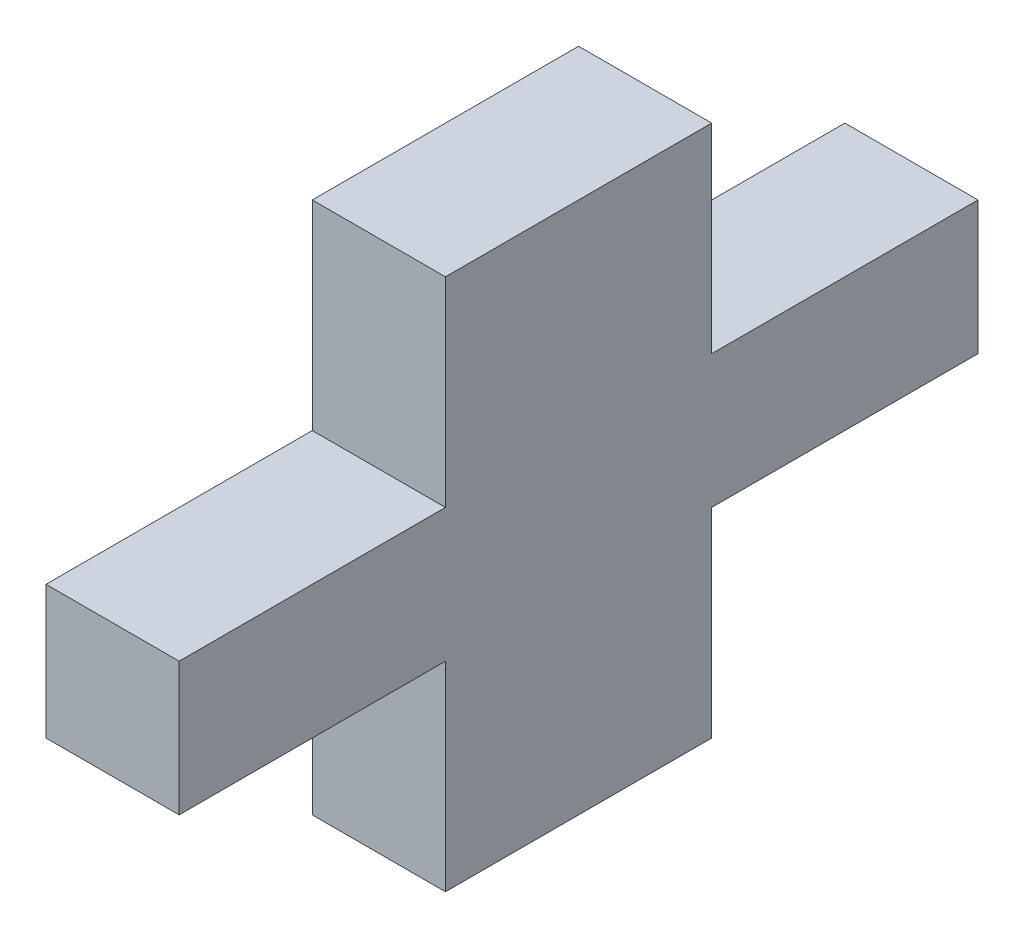
ISO-10303-21;
HEADER;
FILE_DESCRIPTION(('STEP AP214'),'2;1');
FILE_NAME('part.step','',(''),(''),'','','');
FILE_SCHEMA(('AUTOMOTIVE_DESIGN { 1 0 10303 214 1 1 1 1 }'));
ENDSEC;
DATA;
#1=APPLICATION_CONTEXT('core data for automotive mechanical design processes');
#2=APPLICATION_PROTOCOL_DEFINITION('international standard','automotive_design',2000,#1);
#3=PRODUCT_CONTEXT('',#1,'mechanical');
#4=PRODUCT('Part','Part','',(#3));
#5=PRODUCT_RELATED_PRODUCT_CATEGORY('part','',(#4));
#6=PRODUCT_DEFINITION_FORMATION('','',#4);
#7=PRODUCT_DEFINITION_CONTEXT('part definition',#1,'design');
#8=PRODUCT_DEFINITION('design','',#6,#7);
#9=PRODUCT_DEFINITION_SHAPE('','',#8);
#10=(LENGTH_UNIT() NAMED_UNIT(*) SI_UNIT(.MILLI.,.METRE.));
#11=(NAMED_UNIT(*) PLANE_ANGLE_UNIT() SI_UNIT($,.RADIAN.));
#12=(NAMED_UNIT(*) SI_UNIT($,.STERADIAN.) SOLID_ANGLE_UNIT());
#13=UNCERTAINTY_MEASURE_WITH_UNIT(LENGTH_MEASURE(1.E-05),#10,'distance_accuracy_value','');
#14=(GEOMETRIC_REPRESENTATION_CONTEXT(3) GLOBAL_UNCERTAINTY_ASSIGNED_CONTEXT((#13)) GLOBAL_UNIT_ASSIGNED_CONTEXT((#10,
#11,#12)) REPRESENTATION_CONTEXT('',''));
#15=CARTESIAN_POINT('',(0.,0.,0.));
#16=DIRECTION('',(0.,0.,1.));
#17=DIRECTION('',(1.,0.,0.));
#18=AXIS2_PLACEMENT_3D('',#15,#16,#17);
#19=CARTESIAN_POINT('',(10.,20.,10.));
#20=DIRECTION('',(0.,0.,-1.));
#21=DIRECTION('',(0.,1.,0.));
#22=AXIS2_PLACEMENT_3D('',#19,#20,#21);
#23=PLANE('',#22);
#24=DIRECTION('',(0.,-1.,0.));
#25=VECTOR('',#24,1.);
#26=CARTESIAN_POINT('',(0.,20.,10.));
#27=LINE('',#26,#25);
#28=CARTESIAN_POINT('',(0.,20.,10.));
#29=VERTEX_POINT('',#28);
#30=CARTESIAN_POINT('',(0.,5.,10.));
#31=VERTEX_POINT('',#30);
#32=EDGE_CURVE('E164',#29,#31,#27,.T.);
#33=ORIENTED_EDGE('',*,*,#32,.T.);
#34=DIRECTION('',(-1.,0.,0.));
#35=VECTOR('',#34,1.);
#36=CARTESIAN_POINT('',(10.,5.,10.));
#37=LINE('',#36,#35);
#38=CARTESIAN_POINT('',(10.,5.,10.));
#39=VERTEX_POINT('',#38);
#40=EDGE_CURVE('E11',#39,#31,#37,.T.);
#41=ORIENTED_EDGE('',*,*,#40,.F.);
#42=DIRECTION('',(0.,-1.,0.));
#43=VECTOR('',#42,1.);
#44=CARTESIAN_POINT('',(10.,20.,10.));
#45=LINE('',#44,#43);
#46=CARTESIAN_POINT('',(10.,20.,10.));
#47=VERTEX_POINT('',#46);
#48=EDGE_CURVE('E198',#47,#39,#45,.T.);
#49=ORIENTED_EDGE('',*,*,#48,.F.);
#50=DIRECTION('',(-1.,0.,0.));
#51=VECTOR('',#50,1.);
#52=CARTESIAN_POINT('',(10.,20.,10.));
#53=LINE('',#52,#51);
#54=EDGE_CURVE('E160',#47,#29,#53,.T.);
#55=ORIENTED_EDGE('',*,*,#54,.T.);
#56=EDGE_LOOP('',(#33,#41,#49,#55));
#57=FACE_BOUND('',#56,.T.);
#58=ADVANCED_FACE('F39',(#57),#23,.F.);
#59=CARTESIAN_POINT('',(10.,5.,10.));
#60=DIRECTION('',(0.,-1.,0.));
#61=DIRECTION('',(0.,0.,-1.));
#62=AXIS2_PLACEMENT_3D('',#59,#60,#61);
#63=PLANE('',#62);
#64=DIRECTION('',(0.,0.,1.));
#65=VECTOR('',#64,1.);
#66=CARTESIAN_POINT('',(0.,5.,10.));
#67=LINE('',#66,#65);
#68=CARTESIAN_POINT('',(0.,4.99999999999999,30.));
#69=VERTEX_POINT('',#68);
#70=EDGE_CURVE('E168',#31,#69,#67,.T.);
#71=ORIENTED_EDGE('',*,*,#70,.T.);
#72=DIRECTION('',(-1.,0.,0.));
#73=VECTOR('',#72,1.);
#74=CARTESIAN_POINT('',(10.,4.99999999999999,30.));
#75=LINE('',#74,#73);
#76=CARTESIAN_POINT('',(10.,4.99999999999999,30.));
#77=VERTEX_POINT('',#76);
#78=EDGE_CURVE('E48',#77,#69,#75,.T.);
#79=ORIENTED_EDGE('',*,*,#78,.F.);
#80=DIRECTION('',(0.,0.,1.));
#81=VECTOR('',#80,1.);
#82=CARTESIAN_POINT('',(10.,5.,10.));
#83=LINE('',#82,#81);
#84=EDGE_CURVE('E111',#39,#77,#83,.T.);
#85=ORIENTED_EDGE('',*,*,#84,.F.);
#86=ORIENTED_EDGE('',*,*,#40,.T.);
#87=EDGE_LOOP('',(#71,#79,#85,#86));
#88=FACE_BOUND('',#87,.T.);
#89=ADVANCED_FACE('F292',(#88),#63,.F.);
#90=CARTESIAN_POINT('',(10.,4.99999999999999,30.));
#91=DIRECTION('',(0.,0.,-1.));
#92=DIRECTION('',(-1.,0.,0.));
#93=AXIS2_PLACEMENT_3D('',#90,#91,#92);
#94=PLANE('',#93);
#95=DIRECTION('',(0.,-1.,0.));
#96=VECTOR('',#95,1.);
#97=CARTESIAN_POINT('',(0.,4.99999999999999,30.));
#98=LINE('',#97,#96);
#99=CARTESIAN_POINT('',(0.,-4.99999999999999,30.));
#100=VERTEX_POINT('',#99);
#101=EDGE_CURVE('E171',#69,#100,#98,.T.);
#102=ORIENTED_EDGE('',*,*,#101,.T.);
#103=DIRECTION('',(-1.,0.,0.));
#104=VECTOR('',#103,1.);
#105=CARTESIAN_POINT('',(10.,-4.99999999999999,30.));
#106=LINE('',#105,#104);
#107=CARTESIAN_POINT('',(10.,-4.99999999999999,30.));
#108=VERTEX_POINT('',#107);
#109=EDGE_CURVE('E225',#108,#100,#106,.T.);
#110=ORIENTED_EDGE('',*,*,#109,.F.);
#111=DIRECTION('',(0.,-1.,0.));
#112=VECTOR('',#111,1.);
#113=CARTESIAN_POINT('',(10.,4.99999999999999,30.));
#114=LINE('',#113,#112);
#115=EDGE_CURVE('E235',#77,#108,#114,.T.);
#116=ORIENTED_EDGE('',*,*,#115,.F.);
#117=ORIENTED_EDGE('',*,*,#78,.T.);
#118=EDGE_LOOP('',(#102,#110,#116,#117));
#119=FACE_BOUND('',#118,.T.);
#120=ADVANCED_FACE('F233',(#119),#94,.F.);
#121=CARTESIAN_POINT('',(10.,-5.,10.));
#122=DIRECTION('',(0.,1.,0.));
#123=DIRECTION('',(0.,0.,1.));
#124=AXIS2_PLACEMENT_3D('',#121,#122,#123);
#125=PLANE('',#124);
#126=DIRECTION('',(0.,0.,-1.));
#127=VECTOR('',#126,1.);
#128=CARTESIAN_POINT('',(0.,-5.,10.));
#129=LINE('',#128,#127);
#130=CARTESIAN_POINT('',(0.,-5.,10.));
#131=VERTEX_POINT('',#130);
#132=EDGE_CURVE('E174',#100,#131,#129,.T.);
#133=ORIENTED_EDGE('',*,*,#132,.T.);
#134=DIRECTION('',(-1.,0.,0.));
#135=VECTOR('',#134,1.);
#136=CARTESIAN_POINT('',(10.,-5.,10.));
#137=LINE('',#136,#135);
#138=CARTESIAN_POINT('',(10.,-5.,10.));
#139=VERTEX_POINT('',#138);
#140=EDGE_CURVE('E221',#139,#131,#137,.T.);
#141=ORIENTED_EDGE('',*,*,#140,.F.);
#142=DIRECTION('',(0.,0.,-1.));
#143=VECTOR('',#142,1.);
#144=CARTESIAN_POINT('',(10.,-5.,10.));
#145=LINE('',#144,#143);
#146=EDGE_CURVE('E254',#108,#139,#145,.T.);
#147=ORIENTED_EDGE('',*,*,#146,.F.);
#148=ORIENTED_EDGE('',*,*,#109,.T.);
#149=EDGE_LOOP('',(#133,#141,#147,#148));
#150=FACE_BOUND('',#149,.T.);
#151=ADVANCED_FACE('F244',(#150),#125,.F.);
#152=CARTESIAN_POINT('',(10.,-20.,10.));
#153=DIRECTION('',(0.,0.,-1.));
#154=DIRECTION('',(0.,1.,0.));
#155=AXIS2_PLACEMENT_3D('',#152,#153,#154);
#156=PLANE('',#155);
#157=DIRECTION('',(0.,-1.,0.));
#158=VECTOR('',#157,1.);
#159=CARTESIAN_POINT('',(0.,-20.,10.));
#160=LINE('',#159,#158);
#161=CARTESIAN_POINT('',(0.,-20.,10.));
#162=VERTEX_POINT('',#161);
#163=EDGE_CURVE('E177',#131,#162,#160,.T.);
#164=ORIENTED_EDGE('',*,*,#163,.T.);
#165=DIRECTION('',(-1.,0.,0.));
#166=VECTOR('',#165,1.);
#167=CARTESIAN_POINT('',(10.,-20.,10.));
#168=LINE('',#167,#166);
#169=CARTESIAN_POINT('',(10.,-20.,10.));
#170=VERTEX_POINT('',#169);
#171=EDGE_CURVE('E217',#170,#162,#168,.T.);
#172=ORIENTED_EDGE('',*,*,#171,.F.);
#173=DIRECTION('',(0.,-1.,0.));
#174=VECTOR('',#173,1.);
#175=CARTESIAN_POINT('',(10.,-20.,10.));
#176=LINE('',#175,#174);
#177=EDGE_CURVE('E250',#139,#170,#176,.T.);
#178=ORIENTED_EDGE('',*,*,#177,.F.);
#179=ORIENTED_EDGE('',*,*,#140,.T.);
#180=EDGE_LOOP('',(#164,#172,#178,#179));
#181=FACE_BOUND('',#180,.T.);
#182=ADVANCED_FACE('F248',(#181),#156,.F.);
#183=CARTESIAN_POINT('',(10.,-20.,-10.));
#184=DIRECTION('',(0.,1.,0.));
#185=DIRECTION('',(0.,0.,1.));
#186=AXIS2_PLACEMENT_3D('',#183,#184,#185);
#187=PLANE('',#186);
#188=DIRECTION('',(0.,0.,-1.));
#189=VECTOR('',#188,1.);
#190=CARTESIAN_POINT('',(0.,-20.,-10.));
#191=LINE('',#190,#189);
#192=CARTESIAN_POINT('',(0.,-20.,-10.));
#193=VERTEX_POINT('',#192);
#194=EDGE_CURVE('E180',#162,#193,#191,.T.);
#195=ORIENTED_EDGE('',*,*,#194,.T.);
#196=DIRECTION('',(-1.,0.,0.));
#197=VECTOR('',#196,1.);
#198=CARTESIAN_POINT('',(10.,-20.,-10.));
#199=LINE('',#198,#197);
#200=CARTESIAN_POINT('',(10.,-20.,-10.));
#201=VERTEX_POINT('',#200);
#202=EDGE_CURVE('E213',#201,#193,#199,.T.);
#203=ORIENTED_EDGE('',*,*,#202,.F.);
#204=DIRECTION('',(0.,0.,-1.));
#205=VECTOR('',#204,1.);
#206=CARTESIAN_POINT('',(10.,-20.,-10.));
#207=LINE('',#206,#205);
#208=EDGE_CURVE('E253',#170,#201,#207,.T.);
#209=ORIENTED_EDGE('',*,*,#208,.F.);
#210=ORIENTED_EDGE('',*,*,#171,.T.);
#211=EDGE_LOOP('',(#195,#203,#209,#210));
#212=FACE_BOUND('',#211,.T.);
#213=ADVANCED_FACE('F305',(#212),#187,.F.);
#214=CARTESIAN_POINT('',(10.,-20.,-10.));
#215=DIRECTION('',(0.,0.,1.));
#216=DIRECTION('',(0.,-1.,0.));
#217=AXIS2_PLACEMENT_3D('',#214,#215,#216);
#218=PLANE('',#217);
#219=DIRECTION('',(0.,1.,0.));
#220=VECTOR('',#219,1.);
#221=CARTESIAN_POINT('',(0.,-20.,-10.));
#222=LINE('',#221,#220);
#223=CARTESIAN_POINT('',(0.,-5.,-10.));
#224=VERTEX_POINT('',#223);
#225=EDGE_CURVE('E183',#193,#224,#222,.T.);
#226=ORIENTED_EDGE('',*,*,#225,.T.);
#227=DIRECTION('',(-1.,0.,0.));
#228=VECTOR('',#227,1.);
#229=CARTESIAN_POINT('',(10.,-5.,-10.));
#230=LINE('',#229,#228);
#231=CARTESIAN_POINT('',(10.,-5.,-10.));
#232=VERTEX_POINT('',#231);
#233=EDGE_CURVE('E209',#232,#224,#230,.T.);
#234=ORIENTED_EDGE('',*,*,#233,.F.);
#235=DIRECTION('',(0.,1.,0.));
#236=VECTOR('',#235,1.);
#237=CARTESIAN_POINT('',(10.,-20.,-10.));
#238=LINE('',#237,#236);
#239=EDGE_CURVE('E258',#201,#232,#238,.T.);
#240=ORIENTED_EDGE('',*,*,#239,.F.);
#241=ORIENTED_EDGE('',*,*,#202,.T.);
#242=EDGE_LOOP('',(#226,#234,#240,#241));
#243=FACE_BOUND('',#242,.T.);
#244=ADVANCED_FACE('F308',(#243),#218,.F.);
#245=CARTESIAN_POINT('',(10.,-5.,-10.));
#246=DIRECTION('',(0.,1.,0.));
#247=DIRECTION('',(0.,0.,1.));
#248=AXIS2_PLACEMENT_3D('',#245,#246,#247);
#249=PLANE('',#248);
#250=DIRECTION('',(0.,0.,-1.));
#251=VECTOR('',#250,1.);
#252=CARTESIAN_POINT('',(0.,-5.,-10.));
#253=LINE('',#252,#251);
#254=CARTESIAN_POINT('',(0.,-4.99999999999999,-30.));
#255=VERTEX_POINT('',#254);
#256=EDGE_CURVE('E186',#224,#255,#253,.T.);
#257=ORIENTED_EDGE('',*,*,#256,.T.);
#258=DIRECTION('',(-1.,0.,0.));
#259=VECTOR('',#258,1.);
#260=CARTESIAN_POINT('',(10.,-4.99999999999999,-30.));
#261=LINE('',#260,#259);
#262=CARTESIAN_POINT('',(10.,-4.99999999999999,-30.));
#263=VERTEX_POINT('',#262);
#264=EDGE_CURVE('E205',#263,#255,#261,.T.);
#265=ORIENTED_EDGE('',*,*,#264,.F.);
#266=DIRECTION('',(0.,0.,-1.));
#267=VECTOR('',#266,1.);
#268=CARTESIAN_POINT('',(10.,-5.,-10.));
#269=LINE('',#268,#267);
#270=EDGE_CURVE('E265',#232,#263,#269,.T.);
#271=ORIENTED_EDGE('',*,*,#270,.F.);
#272=ORIENTED_EDGE('',*,*,#233,.T.);
#273=EDGE_LOOP('',(#257,#265,#271,#272));
#274=FACE_BOUND('',#273,.T.);
#275=ADVANCED_FACE('F273',(#274),#249,.F.);
#276=CARTESIAN_POINT('',(10.,4.99999999999999,-30.));
#277=DIRECTION('',(0.,0.,1.));
#278=DIRECTION('',(1.,0.,0.));
#279=AXIS2_PLACEMENT_3D('',#276,#277,#278);
#280=PLANE('',#279);
#281=DIRECTION('',(0.,1.,0.));
#282=VECTOR('',#281,1.);
#283=CARTESIAN_POINT('',(0.,4.99999999999999,-30.));
#284=LINE('',#283,#282);
#285=CARTESIAN_POINT('',(0.,4.99999999999999,-30.));
#286=VERTEX_POINT('',#285);
#287=EDGE_CURVE('E189',#255,#286,#284,.T.);
#288=ORIENTED_EDGE('',*,*,#287,.T.);
#289=DIRECTION('',(-1.,0.,0.));
#290=VECTOR('',#289,1.);
#291=CARTESIAN_POINT('',(10.,4.99999999999999,-30.));
#292=LINE('',#291,#290);
#293=CARTESIAN_POINT('',(10.,4.99999999999999,-30.));
#294=VERTEX_POINT('',#293);
#295=EDGE_CURVE('E153',#294,#286,#292,.T.);
#296=ORIENTED_EDGE('',*,*,#295,.F.);
#297=DIRECTION('',(0.,1.,0.));
#298=VECTOR('',#297,1.);
#299=CARTESIAN_POINT('',(10.,4.99999999999999,-30.));
#300=LINE('',#299,#298);
#301=EDGE_CURVE('E142',#263,#294,#300,.T.);
#302=ORIENTED_EDGE('',*,*,#301,.F.);
#303=ORIENTED_EDGE('',*,*,#264,.T.);
#304=EDGE_LOOP('',(#288,#296,#302,#303));
#305=FACE_BOUND('',#304,.T.);
#306=ADVANCED_FACE('F277',(#305),#280,.F.);
#307=CARTESIAN_POINT('',(10.,5.,-10.));
#308=DIRECTION('',(0.,-1.,0.));
#309=DIRECTION('',(0.,0.,-1.));
#310=AXIS2_PLACEMENT_3D('',#307,#308,#309);
#311=PLANE('',#310);
#312=DIRECTION('',(0.,0.,1.));
#313=VECTOR('',#312,1.);
#314=CARTESIAN_POINT('',(0.,5.,-10.));
#315=LINE('',#314,#313);
#316=CARTESIAN_POINT('',(0.,5.,-10.));
#317=VERTEX_POINT('',#316);
#318=EDGE_CURVE('E151',#286,#317,#315,.T.);
#319=ORIENTED_EDGE('',*,*,#318,.T.);
#320=DIRECTION('',(-1.,0.,0.));
#321=VECTOR('',#320,1.);
#322=CARTESIAN_POINT('',(10.,5.,-10.));
#323=LINE('',#322,#321);
#324=CARTESIAN_POINT('',(10.,5.,-10.));
#325=VERTEX_POINT('',#324);
#326=EDGE_CURVE('E148',#325,#317,#323,.T.);
#327=ORIENTED_EDGE('',*,*,#326,.F.);
#328=DIRECTION('',(0.,0.,1.));
#329=VECTOR('',#328,1.);
#330=CARTESIAN_POINT('',(10.,5.,-10.));
#331=LINE('',#330,#329);
#332=EDGE_CURVE('E136',#294,#325,#331,.T.);
#333=ORIENTED_EDGE('',*,*,#332,.F.);
#334=ORIENTED_EDGE('',*,*,#295,.T.);
#335=EDGE_LOOP('',(#319,#327,#333,#334));
#336=FACE_BOUND('',#335,.T.);
#337=ADVANCED_FACE('F149',(#336),#311,.F.);
#338=CARTESIAN_POINT('',(10.,20.,-10.));
#339=DIRECTION('',(0.,0.,1.));
#340=DIRECTION('',(0.,-1.,0.));
#341=AXIS2_PLACEMENT_3D('',#338,#339,#340);
#342=PLANE('',#341);
#343=DIRECTION('',(0.,1.,0.));
#344=VECTOR('',#343,1.);
#345=CARTESIAN_POINT('',(0.,20.,-10.));
#346=LINE('',#345,#344);
#347=CARTESIAN_POINT('',(0.,20.,-10.));
#348=VERTEX_POINT('',#347);
#349=EDGE_CURVE('E97',#317,#348,#346,.T.);
#350=ORIENTED_EDGE('',*,*,#349,.T.);
#351=DIRECTION('',(-1.,0.,0.));
#352=VECTOR('',#351,1.);
#353=CARTESIAN_POINT('',(10.,20.,-10.));
#354=LINE('',#353,#352);
#355=CARTESIAN_POINT('',(10.,20.,-10.));
#356=VERTEX_POINT('',#355);
#357=EDGE_CURVE('E154',#356,#348,#354,.T.);
#358=ORIENTED_EDGE('',*,*,#357,.F.);
#359=DIRECTION('',(0.,1.,0.));
#360=VECTOR('',#359,1.);
#361=CARTESIAN_POINT('',(10.,20.,-10.));
#362=LINE('',#361,#360);
#363=EDGE_CURVE('E140',#325,#356,#362,.T.);
#364=ORIENTED_EDGE('',*,*,#363,.F.);
#365=ORIENTED_EDGE('',*,*,#326,.T.);
#366=EDGE_LOOP('',(#350,#358,#364,#365));
#367=FACE_BOUND('',#366,.T.);
#368=ADVANCED_FACE('F156',(#367),#342,.F.);
#369=CARTESIAN_POINT('',(10.,20.,-10.));
#370=DIRECTION('',(0.,-1.,0.));
#371=DIRECTION('',(0.,0.,-1.));
#372=AXIS2_PLACEMENT_3D('',#369,#370,#371);
#373=PLANE('',#372);
#374=DIRECTION('',(0.,0.,1.));
#375=VECTOR('',#374,1.);
#376=CARTESIAN_POINT('',(0.,20.,-10.));
#377=LINE('',#376,#375);
#378=EDGE_CURVE('E103',#348,#29,#377,.T.);
#379=ORIENTED_EDGE('',*,*,#378,.T.);
#380=ORIENTED_EDGE('',*,*,#54,.F.);
#381=DIRECTION('',(0.,0.,1.));
#382=VECTOR('',#381,1.);
#383=CARTESIAN_POINT('',(10.,20.,-10.));
#384=LINE('',#383,#382);
#385=EDGE_CURVE('E56',#356,#47,#384,.T.);
#386=ORIENTED_EDGE('',*,*,#385,.F.);
#387=ORIENTED_EDGE('',*,*,#357,.T.);
#388=EDGE_LOOP('',(#379,#380,#386,#387));
#389=FACE_BOUND('',#388,.T.);
#390=ADVANCED_FACE('F281',(#389),#373,.F.);
#391=CARTESIAN_POINT('',(10.,0.,0.));
#392=DIRECTION('',(-1.,0.,0.));
#393=DIRECTION('',(0.,0.,1.));
#394=AXIS2_PLACEMENT_3D('',#391,#392,#393);
#395=PLANE('',#394);
#396=ORIENTED_EDGE('',*,*,#48,.T.);
#397=ORIENTED_EDGE('',*,*,#84,.T.);
#398=ORIENTED_EDGE('',*,*,#115,.T.);
#399=ORIENTED_EDGE('',*,*,#146,.T.);
#400=ORIENTED_EDGE('',*,*,#177,.T.);
#401=ORIENTED_EDGE('',*,*,#208,.T.);
#402=ORIENTED_EDGE('',*,*,#239,.T.);
#403=ORIENTED_EDGE('',*,*,#270,.T.);
#404=ORIENTED_EDGE('',*,*,#301,.T.);
#405=ORIENTED_EDGE('',*,*,#332,.T.);
#406=ORIENTED_EDGE('',*,*,#363,.T.);
#407=ORIENTED_EDGE('',*,*,#385,.T.);
#408=EDGE_LOOP('',(#396,#397,#398,#399,#400,#401,#402,#403,#404,#405,#406,#407));
#409=FACE_BOUND('',#408,.T.);
#410=ADVANCED_FACE('F138',(#409),#395,.F.);
#411=CARTESIAN_POINT('',(0.,0.,0.));
#412=DIRECTION('',(-1.,0.,0.));
#413=DIRECTION('',(0.,0.,1.));
#414=AXIS2_PLACEMENT_3D('',#411,#412,#413);
#415=PLANE('',#414);
#416=ORIENTED_EDGE('',*,*,#32,.F.);
#417=ORIENTED_EDGE('',*,*,#378,.F.);
#418=ORIENTED_EDGE('',*,*,#349,.F.);
#419=ORIENTED_EDGE('',*,*,#318,.F.);
#420=ORIENTED_EDGE('',*,*,#287,.F.);
#421=ORIENTED_EDGE('',*,*,#256,.F.);
#422=ORIENTED_EDGE('',*,*,#225,.F.);
#423=ORIENTED_EDGE('',*,*,#194,.F.);
#424=ORIENTED_EDGE('',*,*,#163,.F.);
#425=ORIENTED_EDGE('',*,*,#132,.F.);
#426=ORIENTED_EDGE('',*,*,#101,.F.);
#427=ORIENTED_EDGE('',*,*,#70,.F.);
#428=EDGE_LOOP('',(#416,#417,#418,#419,#420,#421,#422,#423,#424,#425,#426,#427));
#429=FACE_BOUND('',#428,.T.);
#430=ADVANCED_FACE('F239',(#429),#415,.T.);
#431=CLOSED_SHELL('',(#58,#89,#120,#151,#182,#213,#244,#275,#306,#337,#368,#390,#410,#430));
#432=MANIFOLD_SOLID_BREP('B2',#431);
#433=ADVANCED_BREP_SHAPE_REPRESENTATION('',(#18,#432),#14);
#434=SHAPE_DEFINITION_REPRESENTATION(#9,#433);
ENDSEC;
END-ISO-10303-21;
